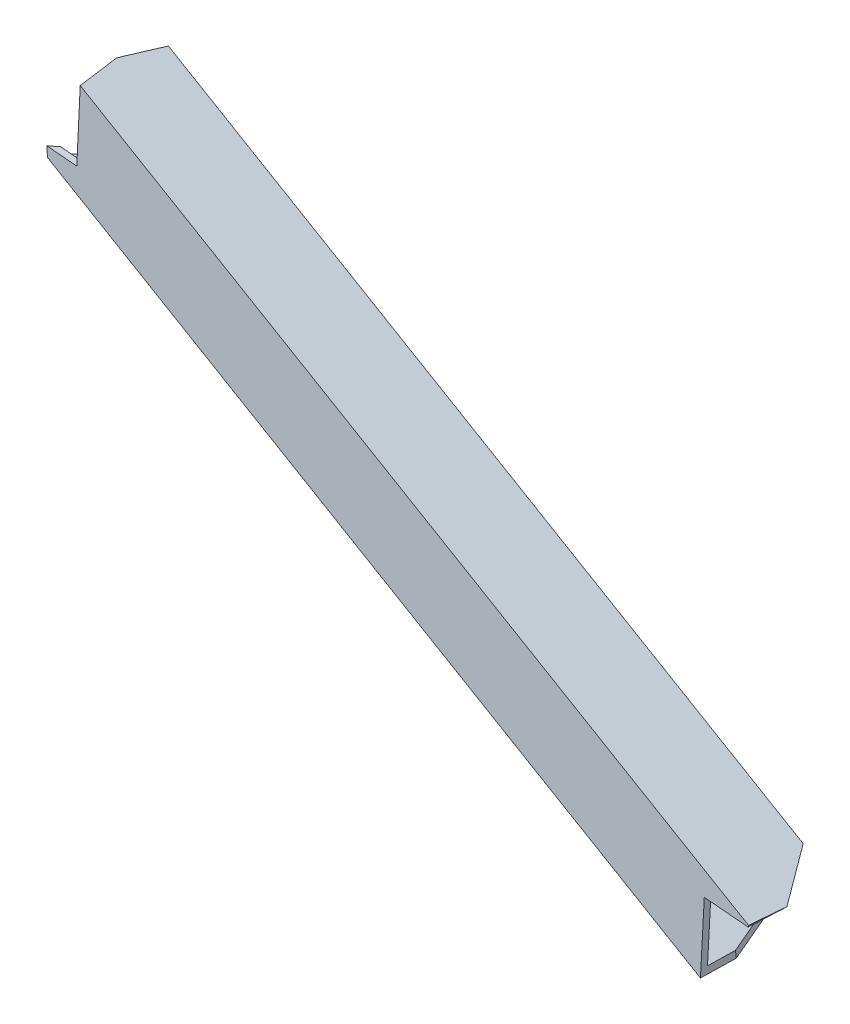
ISO-10303-21;
HEADER;
FILE_DESCRIPTION(('STEP AP214'),'2;1');
FILE_NAME('part.step','',(''),(''),'','','');
FILE_SCHEMA(('AUTOMOTIVE_DESIGN { 1 0 10303 214 1 1 1 1 }'));
ENDSEC;
DATA;
#1=APPLICATION_CONTEXT('core data for automotive mechanical design processes');
#2=APPLICATION_PROTOCOL_DEFINITION('international standard','automotive_design',2000,#1);
#3=PRODUCT_CONTEXT('',#1,'mechanical');
#4=PRODUCT('Part','Part','',(#3));
#5=PRODUCT_RELATED_PRODUCT_CATEGORY('part','',(#4));
#6=PRODUCT_DEFINITION_FORMATION('','',#4);
#7=PRODUCT_DEFINITION_CONTEXT('part definition',#1,'design');
#8=PRODUCT_DEFINITION('design','',#6,#7);
#9=PRODUCT_DEFINITION_SHAPE('','',#8);
#10=(LENGTH_UNIT() NAMED_UNIT(*) SI_UNIT(.MILLI.,.METRE.));
#11=(NAMED_UNIT(*) PLANE_ANGLE_UNIT() SI_UNIT($,.RADIAN.));
#12=(NAMED_UNIT(*) SI_UNIT($,.STERADIAN.) SOLID_ANGLE_UNIT());
#13=UNCERTAINTY_MEASURE_WITH_UNIT(LENGTH_MEASURE(1.E-05),#10,'distance_accuracy_value','');
#14=(GEOMETRIC_REPRESENTATION_CONTEXT(3) GLOBAL_UNCERTAINTY_ASSIGNED_CONTEXT((#13)) GLOBAL_UNIT_ASSIGNED_CONTEXT((#10,
#11,#12)) REPRESENTATION_CONTEXT('',''));
#15=CARTESIAN_POINT('',(0.,0.,0.));
#16=DIRECTION('',(0.,0.,1.));
#17=DIRECTION('',(1.,0.,0.));
#18=AXIS2_PLACEMENT_3D('',#15,#16,#17);
#19=CARTESIAN_POINT('',(-259.935326726564,-10.,-1698.86453408839));
#20=DIRECTION('',(0.,1.,0.));
#21=DIRECTION('',(0.,0.,1.));
#22=AXIS2_PLACEMENT_3D('',#19,#20,#21);
#23=PLANE('',#22);
#24=DIRECTION('',(0.0519070217012584,0.,0.99865192189176));
#25=VECTOR('',#24,1.);
#26=CARTESIAN_POINT('',(-250.99441719747,-10.,-1679.98173316467));
#27=LINE('',#26,#25);
#28=CARTESIAN_POINT('',(-252.538611746394,-10.,-1709.69087084037));
#29=VERTEX_POINT('',#28);
#30=CARTESIAN_POINT('',(-252.402179540687,-10.,-1707.06601817166));
#31=VERTEX_POINT('',#30);
#32=EDGE_CURVE('E174',#29,#31,#27,.T.);
#33=ORIENTED_EDGE('',*,*,#32,.T.);
#34=CARTESIAN_POINT('',(-251.467391304348,-10.,-1697.32050807569));
#35=DIRECTION('',(0.,1.,0.));
#36=DIRECTION('',(-0.480327336741099,0.,0.87708930536132));
#37=AXIS2_PLACEMENT_3D('',#34,#35,#36);
#38=ELLIPSE('',#37,9.93342614996473,9.49999999999999);
#39=CARTESIAN_POINT('',(-248.27907507284,-10.,-1706.71374857818));
#40=VERTEX_POINT('',#39);
#41=EDGE_CURVE('E11',#31,#40,#38,.F.);
#42=ORIENTED_EDGE('',*,*,#41,.T.);
#43=DIRECTION('',(0.0519070217012584,0.,0.99865192189176));
#44=VECTOR('',#43,1.);
#45=CARTESIAN_POINT('',(-246.818497299535,-10.,-1678.61333455754));
#46=LINE('',#45,#44);
#47=CARTESIAN_POINT('',(-248.33243386697,-10.,-1707.74033150591));
#48=VERTEX_POINT('',#47);
#49=EDGE_CURVE('E214',#48,#40,#46,.T.);
#50=ORIENTED_EDGE('',*,*,#49,.F.);
#51=DIRECTION('',(-0.996697420861703,0.,-0.0812049952135342));
#52=VECTOR('',#51,1.);
#53=CARTESIAN_POINT('',(-55.7578427552069,-10.,-1692.05049583245));
#54=LINE('',#53,#52);
#55=CARTESIAN_POINT('',(-237.968255997214,-10.,-1706.89591975497));
#56=VERTEX_POINT('',#55);
#57=EDGE_CURVE('E199',#56,#48,#54,.T.);
#58=ORIENTED_EDGE('',*,*,#57,.F.);
#59=DIRECTION('',(-0.242535625036333,0.,0.970142500145332));
#60=VECTOR('',#59,1.);
#61=CARTESIAN_POINT('',(-165.298574998547,-10.,-1997.57464374964));
#62=LINE('',#61,#60);
#63=CARTESIAN_POINT('',(-237.574318690023,-10.,-1708.47166898373));
#64=VERTEX_POINT('',#63);
#65=EDGE_CURVE('E206',#64,#56,#62,.T.);
#66=ORIENTED_EDGE('',*,*,#65,.F.);
#67=DIRECTION('',(-0.996697420861703,0.,-0.0812049952135336));
#68=VECTOR('',#67,1.);
#69=CARTESIAN_POINT('',(-55.010784211944,-10.,-1693.59747483699));
#70=LINE('',#69,#68);
#71=EDGE_CURVE('E316',#64,#29,#70,.T.);
#72=ORIENTED_EDGE('',*,*,#71,.T.);
#73=EDGE_LOOP('',(#33,#42,#50,#58,#66,#72));
#74=FACE_BOUND('',#73,.T.);
#75=ADVANCED_FACE('F39',(#74),#23,.T.);
#76=CARTESIAN_POINT('',(-63.0871154005148,-89.7690510930017,-1689.74860806712));
#77=DIRECTION('',(0.389788086231143,0.920681692103509,-0.0202600507818227));
#78=DIRECTION('',(-0.920870706243423,0.389868108958324,0.));
#79=AXIS2_PLACEMENT_3D('',#76,#77,#78);
#80=PLANE('',#79);
#81=CARTESIAN_POINT('',(-251.492301515799,-10.1697584780347,-1697.27502142859));
#82=DIRECTION('',(0.389788086231143,0.920681692103509,-0.0202600507818227));
#83=DIRECTION('',(0.66523424743655,-0.266289990776878,0.697533538153956));
#84=AXIS2_PLACEMENT_3D('',#81,#82,#83);
#85=ELLIPSE('',#84,10.1020544804535,9.49999999999999);
#86=CARTESIAN_POINT('',(-246.200919955857,-12.2267833251741,-1688.95064077322));
#87=VERTEX_POINT('',#86);
#88=EDGE_CURVE('E327',#31,#87,#85,.F.);
#89=ORIENTED_EDGE('',*,*,#88,.F.);
#90=ORIENTED_EDGE('',*,*,#32,.F.);
#91=DIRECTION('',(-0.917328644212009,0.386243639668214,-0.0965609099170536));
#92=VECTOR('',#91,1.);
#93=CARTESIAN_POINT('',(-63.0871154005148,-89.7690510930017,-1689.74860806712));
#94=LINE('',#93,#92);
#95=CARTESIAN_POINT('',(-74.1970478620124,-85.0911847934237,-1690.91807464201));
#96=VERTEX_POINT('',#95);
#97=EDGE_CURVE('E225',#96,#29,#94,.T.);
#98=ORIENTED_EDGE('',*,*,#97,.F.);
#99=DIRECTION('',(-0.331543273132427,0.119772265723642,-0.935806423574909));
#100=VECTOR('',#99,1.);
#101=CARTESIAN_POINT('',(-72.4272379255188,-85.7305406880294,-1685.92264978712));
#102=LINE('',#101,#100);
#103=CARTESIAN_POINT('',(-70.0000000000002,-86.6073969217361,-1679.07158379871));
#104=VERTEX_POINT('',#103);
#105=EDGE_CURVE('E285',#104,#96,#102,.T.);
#106=ORIENTED_EDGE('',*,*,#105,.F.);
#107=DIRECTION('',(0.,-0.0220001628763165,-0.999757967126752));
#108=VECTOR('',#107,1.);
#109=CARTESIAN_POINT('',(-70.0000000000002,-86.8437666053328,-1689.81298038252));
#110=LINE('',#109,#108);
#111=CARTESIAN_POINT('',(-70.0000000000002,-86.416644359219,-1670.40317551471));
#112=VERTEX_POINT('',#111);
#113=EDGE_CURVE('E262',#112,#104,#110,.T.);
#114=ORIENTED_EDGE('',*,*,#113,.F.);
#115=DIRECTION('',(-0.917328644212009,0.386243639668214,-0.0965609099170536));
#116=VECTOR('',#115,1.);
#117=CARTESIAN_POINT('',(-64.7086463241079,-88.6445827490684,-1669.84619091725));
#118=LINE('',#117,#116);
#119=EDGE_CURVE('E234',#112,#87,#118,.T.);
#120=ORIENTED_EDGE('',*,*,#119,.T.);
#121=EDGE_LOOP('',(#89,#90,#98,#106,#114,#120));
#122=FACE_BOUND('',#121,.T.);
#123=ADVANCED_FACE('F325',(#122),#80,.F.);
#124=CARTESIAN_POINT('',(-56.9128845994852,-70.2309489069982,-1670.25139193288));
#125=DIRECTION('',(0.0810765461796534,-0.056223417196662,-0.995120857493354));
#126=DIRECTION('',(-0.996697420861703,0.,-0.0812049952135336));
#127=AXIS2_PLACEMENT_3D('',#124,#125,#126);
#128=PLANE('',#127);
#129=CARTESIAN_POINT('',(-256.600489873603,-44.9811161756627,-1687.94734624608));
#130=DIRECTION('',(0.0810765461796534,-0.056223417196662,-0.995120857493354));
#131=DIRECTION('',(-0.125978718068656,-0.99097858296094,0.0457253836124391));
#132=AXIS2_PLACEMENT_3D('',#129,#130,#131);
#133=ELLIPSE('',#132,44.681659567392,9.49999999999999);
#134=CARTESIAN_POINT('',(-246.500195257675,-10.,-1689.10083516881));
#135=VERTEX_POINT('',#134);
#136=EDGE_CURVE('E62',#87,#135,#133,.F.);
#137=ORIENTED_EDGE('',*,*,#136,.F.);
#138=ORIENTED_EDGE('',*,*,#119,.F.);
#139=DIRECTION('',(0.,-0.998407737776047,0.0564091229227733));
#140=VECTOR('',#139,1.);
#141=CARTESIAN_POINT('',(-70.0000000000002,-70.2909999601044,-1671.31425965669));
#142=LINE('',#141,#140);
#143=CARTESIAN_POINT('',(-70.0000000000002,-69.9999999999998,-1671.33070088796));
#144=VERTEX_POINT('',#143);
#145=EDGE_CURVE('E261',#144,#112,#142,.T.);
#146=ORIENTED_EDGE('',*,*,#145,.F.);
#147=DIRECTION('',(-0.996697420861703,0.,-0.0812049952135336));
#148=VECTOR('',#147,1.);
#149=CARTESIAN_POINT('',(-56.9118285034804,-69.9999999999998,-1670.26435429021));
#150=LINE('',#149,#148);
#151=CARTESIAN_POINT('',(-58.4694290318394,-69.9999999999998,-1670.39125834434));
#152=VERTEX_POINT('',#151);
#153=EDGE_CURVE('E266',#152,#144,#150,.T.);
#154=ORIENTED_EDGE('',*,*,#153,.F.);
#155=DIRECTION('',(-0.199222248814033,-0.97917434035687,0.0390910061800458));
#156=VECTOR('',#155,1.);
#157=CARTESIAN_POINT('',(-58.4537917747577,-69.9231431179037,-1670.39432665682));
#158=LINE('',#157,#156);
#159=CARTESIAN_POINT('',(-58.389887195482,-69.6090530771048,-1670.40686589036));
#160=VERTEX_POINT('',#159);
#161=EDGE_CURVE('E291',#160,#152,#158,.T.);
#162=ORIENTED_EDGE('',*,*,#161,.F.);
#163=DIRECTION('',(-0.917328644212009,0.386243639668214,-0.0965609099170536));
#164=VECTOR('',#163,1.);
#165=CARTESIAN_POINT('',(-56.9128845994852,-70.2309489069982,-1670.25139193288));
#166=LINE('',#165,#164);
#167=CARTESIAN_POINT('',(-238.722245095367,6.32036077547827,-1689.3892193535));
#168=VERTEX_POINT('',#167);
#169=EDGE_CURVE('E232',#160,#168,#166,.T.);
#170=ORIENTED_EDGE('',*,*,#169,.T.);
#171=DIRECTION('',(-0.00650701564536868,0.998356602920274,-0.056936386896976));
#172=VECTOR('',#171,1.);
#173=CARTESIAN_POINT('',(-238.210154803049,-72.2484874476755,-1684.90842929572));
#174=LINE('',#173,#172);
#175=CARTESIAN_POINT('',(-238.615873441598,-10.,-1688.45846738302));
#176=VERTEX_POINT('',#175);
#177=EDGE_CURVE('E209',#176,#168,#174,.T.);
#178=ORIENTED_EDGE('',*,*,#177,.F.);
#179=DIRECTION('',(0.996697420861703,0.,0.0812049952135336));
#180=VECTOR('',#179,1.);
#181=CARTESIAN_POINT('',(-56.6374571669114,-10.,-1673.63194519761));
#182=LINE('',#181,#180);
#183=EDGE_CURVE('E202',#135,#176,#182,.T.);
#184=ORIENTED_EDGE('',*,*,#183,.F.);
#185=EDGE_LOOP('',(#137,#138,#146,#154,#162,#170,#178,#184));
#186=FACE_BOUND('',#185,.T.);
#187=ADVANCED_FACE('F357',(#186),#128,.F.);
#188=CARTESIAN_POINT('',(-55.2913536758921,-71.3554172509315,-1690.15380908275));
#189=DIRECTION('',(-0.389788086231143,-0.920681692103509,0.0202600507818227));
#190=DIRECTION('',(0.920870706243423,-0.389868108958324,0.));
#191=AXIS2_PLACEMENT_3D('',#188,#189,#190);
#192=PLANE('',#191);
#193=CARTESIAN_POINT('',(-248.507698484202,10.1697584780347,-1702.72497857141));
#194=DIRECTION('',(-0.389788086231143,-0.920681692103509,0.0202600507818227));
#195=DIRECTION('',(0.66523424743655,-0.266289990776878,0.697533538153956));
#196=AXIS2_PLACEMENT_3D('',#193,#194,#195);
#197=ELLIPSE('',#196,10.1020544804535,9.49999999999999);
#198=CARTESIAN_POINT('',(-239.849469145952,6.58054772504688,-1699.25242979613));
#199=VERTEX_POINT('',#198);
#200=CARTESIAN_POINT('',(-239.601381429903,6.45106723792768,-1700.36341802421));
#201=VERTEX_POINT('',#200);
#202=EDGE_CURVE('E236',#199,#201,#197,.F.);
#203=ORIENTED_EDGE('',*,*,#202,.F.);
#204=DIRECTION('',(-0.113507613195636,0.0261999374612772,-0.993191615461818));
#205=VECTOR('',#204,1.);
#206=CARTESIAN_POINT('',(-236.214121953579,5.74143335721979,-1667.44314186286));
#207=LINE('',#206,#205);
#208=EDGE_CURVE('E205',#168,#199,#207,.T.);
#209=ORIENTED_EDGE('',*,*,#208,.F.);
#210=ORIENTED_EDGE('',*,*,#169,.F.);
#211=DIRECTION('',(-0.0422484460755079,0.039855023737651,0.998311898099525));
#212=VECTOR('',#211,1.);
#213=CARTESIAN_POINT('',(-57.5485466570465,-70.4027307207954,-1690.28736678198));
#214=LINE('',#213,#212);
#215=CARTESIAN_POINT('',(-58.0135824280842,-69.9640397530746,-1679.29877935703));
#216=VERTEX_POINT('',#215);
#217=EDGE_CURVE('E290',#216,#160,#214,.T.);
#218=ORIENTED_EDGE('',*,*,#217,.F.);
#219=DIRECTION('',(0.5451826238665,-0.212971064645943,0.810813931958259));
#220=VECTOR('',#219,1.);
#221=CARTESIAN_POINT('',(-61.8412956585872,-68.4687753661099,-1684.99148319418));
#222=LINE('',#221,#220);
#223=CARTESIAN_POINT('',(-66.0756795254059,-66.8146484721888,-1691.28900127744));
#224=VERTEX_POINT('',#223);
#225=EDGE_CURVE('E270',#224,#216,#222,.T.);
#226=ORIENTED_EDGE('',*,*,#225,.F.);
#227=DIRECTION('',(-0.917328644212009,0.386243639668214,-0.0965609099170536));
#228=VECTOR('',#227,1.);
#229=CARTESIAN_POINT('',(-55.2913536758921,-71.3554172509315,-1690.15380908275));
#230=LINE('',#229,#228);
#231=CARTESIAN_POINT('',(-237.362439306566,5.30609248829959,-1709.31918651756));
#232=VERTEX_POINT('',#231);
#233=EDGE_CURVE('E229',#224,#232,#230,.T.);
#234=ORIENTED_EDGE('',*,*,#233,.T.);
#235=DIRECTION('',(0.240691344665425,-0.123087376499567,-0.962765378661698));
#236=VECTOR('',#235,1.);
#237=CARTESIAN_POINT('',(-228.98463870736,1.02176104287016,-1742.83038891438));
#238=LINE('',#237,#236);
#239=EDGE_CURVE('E272',#201,#232,#238,.T.);
#240=ORIENTED_EDGE('',*,*,#239,.F.);
#241=EDGE_LOOP('',(#203,#209,#210,#218,#226,#234,#240));
#242=FACE_BOUND('',#241,.T.);
#243=ADVANCED_FACE('F370',(#242),#192,.F.);
#244=CARTESIAN_POINT('',(-55.2913536758921,-71.3554172509315,-1690.15380908275));
#245=DIRECTION('',(-0.0810765461796534,0.056223417196662,0.995120857493354));
#246=DIRECTION('',(0.996697420861703,0.,0.0812049952135336));
#247=AXIS2_PLACEMENT_3D('',#244,#245,#246);
#248=PLANE('',#247);
#249=ORIENTED_EDGE('',*,*,#71,.F.);
#250=DIRECTION('',(-0.0138203212509284,-0.998375169086681,0.0552812850037135));
#251=VECTOR('',#250,1.);
#252=CARTESIAN_POINT('',(-238.400071148149,-69.6520685038425,-1705.16865915123));
#253=LINE('',#252,#251);
#254=EDGE_CURVE('E210',#232,#64,#253,.T.);
#255=ORIENTED_EDGE('',*,*,#254,.F.);
#256=ORIENTED_EDGE('',*,*,#233,.F.);
#257=DIRECTION('',(0.994614005315425,-0.0601185166345809,0.0844318920080898));
#258=VECTOR('',#257,1.);
#259=CARTESIAN_POINT('',(-55.0403652895334,-67.4816677569683,-1690.35222333659));
#260=LINE('',#259,#258);
#261=CARTESIAN_POINT('',(-75.3880820949328,-66.2517689774382,-1692.07952279019));
#262=VERTEX_POINT('',#261);
#263=EDGE_CURVE('E256',#262,#224,#260,.T.);
#264=ORIENTED_EDGE('',*,*,#263,.F.);
#265=DIRECTION('',(-0.0629752890348987,0.996123892552847,-0.061410940852061));
#266=VECTOR('',#265,1.);
#267=CARTESIAN_POINT('',(-74.9807753597959,-72.6944225433909,-1691.68233382602));
#268=LINE('',#267,#266);
#269=EDGE_CURVE('E267',#96,#262,#268,.T.);
#270=ORIENTED_EDGE('',*,*,#269,.F.);
#271=ORIENTED_EDGE('',*,*,#97,.T.);
#272=EDGE_LOOP('',(#249,#255,#256,#264,#270,#271));
#273=FACE_BOUND('',#272,.T.);
#274=ADVANCED_FACE('F329',(#273),#248,.F.);
#275=CARTESIAN_POINT('',(-56.0447370877494,-72.7385504907824,-1688.52919962951));
#276=DIRECTION('',(-0.081076546179654,0.0562234171966604,0.995120857493354));
#277=DIRECTION('',(0.996697420861703,0.,0.0812049952135342));
#278=AXIS2_PLACEMENT_3D('',#275,#276,#277);
#279=PLANE('',#278);
#280=DIRECTION('',(-0.013820321250928,-0.998375169086681,0.055281285003712));
#281=VECTOR('',#280,1.);
#282=CARTESIAN_POINT('',(-238.81319872597,-71.0383669362445,-1703.51614883994));
#283=LINE('',#282,#281);
#284=CARTESIAN_POINT('',(-237.777495030095,3.78050548494219,-1707.65896362344));
#285=VERTEX_POINT('',#284);
#286=EDGE_CURVE('E228',#285,#56,#283,.T.);
#287=ORIENTED_EDGE('',*,*,#286,.T.);
#288=ORIENTED_EDGE('',*,*,#57,.T.);
#289=DIRECTION('',(-0.917328644212009,0.386243639668214,-0.0965609099170536));
#290=VECTOR('',#289,1.);
#291=CARTESIAN_POINT('',(-62.5931769364322,-88.2060029181212,-1688.18883077638));
#292=LINE('',#291,#290);
#293=CARTESIAN_POINT('',(-73.7188102055264,-83.5215257521868,-1689.35995006786));
#294=VERTEX_POINT('',#293);
#295=EDGE_CURVE('E211',#294,#48,#292,.T.);
#296=ORIENTED_EDGE('',*,*,#295,.F.);
#297=DIRECTION('',(-0.0629752890348982,0.996123892552847,-0.0614109408520595));
#298=VECTOR('',#297,1.);
#299=CARTESIAN_POINT('',(-74.3219328778287,-73.9815154842255,-1689.94809077071));
#300=LINE('',#299,#298);
#301=CARTESIAN_POINT('',(-74.7840448905734,-66.6719687717751,-1690.39872361284));
#302=VERTEX_POINT('',#301);
#303=EDGE_CURVE('E278',#294,#302,#300,.T.);
#304=ORIENTED_EDGE('',*,*,#303,.T.);
#305=DIRECTION('',(0.994614005315425,-0.060118516634581,0.0844318920080903));
#306=VECTOR('',#305,1.);
#307=CARTESIAN_POINT('',(-55.7263062763036,-67.8238960217197,-1688.78092925242));
#308=LINE('',#307,#306);
#309=CARTESIAN_POINT('',(-69.7268905968333,-66.9776437501155,-1689.96942631468));
#310=VERTEX_POINT('',#309);
#311=EDGE_CURVE('E224',#302,#310,#308,.T.);
#312=ORIENTED_EDGE('',*,*,#311,.T.);
#313=DIRECTION('',(-0.917328644212009,0.386243639668214,-0.0965609099170536));
#314=VECTOR('',#313,1.);
#315=CARTESIAN_POINT('',(-56.0447370877494,-72.7385504907824,-1688.52919962951));
#316=LINE('',#315,#314);
#317=EDGE_CURVE('E221',#310,#285,#316,.T.);
#318=ORIENTED_EDGE('',*,*,#317,.T.);
#319=EDGE_LOOP('',(#287,#288,#296,#304,#312,#318));
#320=FACE_BOUND('',#319,.T.);
#321=ADVANCED_FACE('F41',(#320),#279,.T.);
#322=CARTESIAN_POINT('',(-56.0447370877494,-72.7385504907824,-1688.52919962951));
#323=DIRECTION('',(-0.389788086231143,-0.920681692103509,0.0202600507818227));
#324=DIRECTION('',(0.920870706243423,-0.389868108958324,0.));
#325=AXIS2_PLACEMENT_3D('',#322,#323,#324);
#326=PLANE('',#325);
#327=DIRECTION('',(-0.917328644212009,0.386243639668214,-0.0965609099170536));
#328=VECTOR('',#327,1.);
#329=CARTESIAN_POINT('',(-57.4068230635673,-71.7939970818785,-1671.81116922362));
#330=LINE('',#329,#328);
#331=CARTESIAN_POINT('',(-61.6675661330291,-69.9999999999998,-1672.25966849409));
#332=VERTEX_POINT('',#331);
#333=CARTESIAN_POINT('',(-238.896661482556,4.62277698927478,-1690.91536274141));
#334=VERTEX_POINT('',#333);
#335=EDGE_CURVE('E217',#332,#334,#330,.T.);
#336=ORIENTED_EDGE('',*,*,#335,.T.);
#337=DIRECTION('',(-0.113507613195636,0.0261999374612772,-0.993191615461818));
#338=VECTOR('',#337,1.);
#339=CARTESIAN_POINT('',(-236.041733359391,3.9637997085662,-1665.93474166371));
#340=LINE('',#339,#338);
#341=CARTESIAN_POINT('',(-239.858774037238,4.84485274308265,-1699.33384759487));
#342=VERTEX_POINT('',#341);
#343=EDGE_CURVE('E220',#334,#342,#340,.T.);
#344=ORIENTED_EDGE('',*,*,#343,.T.);
#345=DIRECTION('',(0.240691344665425,-0.123087376499567,-0.962765378661698));
#346=VECTOR('',#345,1.);
#347=CARTESIAN_POINT('',(-229.41526220707,-0.495864740566232,-1741.10789491555));
#348=LINE('',#347,#346);
#349=EDGE_CURVE('E247',#342,#285,#348,.T.);
#350=ORIENTED_EDGE('',*,*,#349,.T.);
#351=ORIENTED_EDGE('',*,*,#317,.F.);
#352=DIRECTION('',(0.5451826238665,-0.212971064645943,0.810813931958259));
#353=VECTOR('',#352,1.);
#354=CARTESIAN_POINT('',(-64.3546966469618,-69.0762467042492,-1681.97971881291));
#355=LINE('',#354,#353);
#356=CARTESIAN_POINT('',(-61.9899892796963,-69.9999999999998,-1678.46284649445));
#357=VERTEX_POINT('',#356);
#358=EDGE_CURVE('E195',#310,#357,#355,.T.);
#359=ORIENTED_EDGE('',*,*,#358,.T.);
#360=DIRECTION('',(0.0519070217012584,0.,0.99865192189176));
#361=VECTOR('',#360,1.);
#362=CARTESIAN_POINT('',(-62.4957807758298,-69.9999999999998,-1688.19389314547));
#363=LINE('',#362,#361);
#364=EDGE_CURVE('E190',#357,#332,#363,.T.);
#365=ORIENTED_EDGE('',*,*,#364,.T.);
#366=EDGE_LOOP('',(#336,#344,#350,#351,#359,#365));
#367=FACE_BOUND('',#366,.T.);
#368=ADVANCED_FACE('F344',(#367),#326,.T.);
#369=CARTESIAN_POINT('',(-57.4068230635673,-71.7939970818785,-1671.81116922362));
#370=DIRECTION('',(0.0810765461796534,-0.056223417196662,-0.995120857493354));
#371=DIRECTION('',(-0.996697420861703,0.,-0.0812049952135336));
#372=AXIS2_PLACEMENT_3D('',#369,#370,#371);
#373=PLANE('',#372);
#374=DIRECTION('',(-0.917328644212009,0.386243639668214,-0.0965609099170536));
#375=VECTOR('',#374,1.);
#376=CARTESIAN_POINT('',(-63.9552629122506,-87.2614495092173,-1671.47080037049));
#377=LINE('',#376,#375);
#378=CARTESIAN_POINT('',(-70.0000000000002,-84.7162970512174,-1672.10708848499));
#379=VERTEX_POINT('',#378);
#380=CARTESIAN_POINT('',(-244.687864207849,-11.1635121215968,-1690.49528471739));
#381=VERTEX_POINT('',#380);
#382=EDGE_CURVE('E183',#379,#381,#377,.T.);
#383=ORIENTED_EDGE('',*,*,#382,.T.);
#384=CARTESIAN_POINT('',(-255.544411493826,-37.7841375875564,-1689.87577084671));
#385=DIRECTION('',(0.0810765461796534,-0.056223417196662,-0.995120857493354));
#386=DIRECTION('',(-0.125978718068656,-0.99097858296094,0.0457253836124391));
#387=AXIS2_PLACEMENT_3D('',#384,#385,#386);
#388=ELLIPSE('',#387,44.681659567392,9.49999999999999);
#389=CARTESIAN_POINT('',(-244.741471585079,-10.,-1690.56538969801));
#390=VERTEX_POINT('',#389);
#391=EDGE_CURVE('E169',#381,#390,#388,.F.);
#392=ORIENTED_EDGE('',*,*,#391,.T.);
#393=DIRECTION('',(0.996697420861703,0.,0.0812049952135336));
#394=VECTOR('',#393,1.);
#395=CARTESIAN_POINT('',(-57.1242480373791,-10.,-1675.27945093537));
#396=LINE('',#395,#394);
#397=CARTESIAN_POINT('',(-238.801354216225,-10.,-1690.08142416101));
#398=VERTEX_POINT('',#397);
#399=EDGE_CURVE('E179',#390,#398,#396,.T.);
#400=ORIENTED_EDGE('',*,*,#399,.T.);
#401=DIRECTION('',(-0.00650701564536868,0.998356602920274,-0.056936386896976));
#402=VECTOR('',#401,1.);
#403=CARTESIAN_POINT('',(-238.385471166749,-73.8079898859503,-1686.4424474781));
#404=LINE('',#403,#402);
#405=EDGE_CURVE('E189',#398,#334,#404,.T.);
#406=ORIENTED_EDGE('',*,*,#405,.T.);
#407=ORIENTED_EDGE('',*,*,#335,.F.);
#408=DIRECTION('',(-0.996697420861703,0.,-0.0812049952135336));
#409=VECTOR('',#408,1.);
#410=CARTESIAN_POINT('',(-57.3986193739481,-69.9999999999998,-1671.91186002797));
#411=LINE('',#410,#409);
#412=CARTESIAN_POINT('',(-70.0000000000002,-69.9999999999998,-1672.93854579238));
#413=VERTEX_POINT('',#412);
#414=EDGE_CURVE('E192',#332,#413,#411,.T.);
#415=ORIENTED_EDGE('',*,*,#414,.T.);
#416=DIRECTION('',(0.,-0.998407737776047,0.0564091229227733));
#417=VECTOR('',#416,1.);
#418=CARTESIAN_POINT('',(-70.0000000000002,-71.8517816672392,-1672.83392182389));
#419=LINE('',#418,#417);
#420=EDGE_CURVE('E216',#413,#379,#419,.T.);
#421=ORIENTED_EDGE('',*,*,#420,.T.);
#422=EDGE_LOOP('',(#383,#392,#400,#406,#407,#415,#421));
#423=FACE_BOUND('',#422,.T.);
#424=ADVANCED_FACE('F177',(#423),#373,.T.);
#425=CARTESIAN_POINT('',(-62.5931769364322,-88.2060029181212,-1688.18883077638));
#426=DIRECTION('',(0.389788086231143,0.920681692103509,-0.0202600507818227));
#427=DIRECTION('',(-0.920870706243423,0.389868108958324,0.));
#428=AXIS2_PLACEMENT_3D('',#425,#426,#427);
#429=PLANE('',#428);
#430=ORIENTED_EDGE('',*,*,#49,.T.);
#431=CARTESIAN_POINT('',(-251.253533273271,-8.5425971215487,-1697.71101800002));
#432=DIRECTION('',(0.389788086231143,0.920681692103509,-0.0202600507818227));
#433=DIRECTION('',(0.66523424743655,-0.266289990776878,0.697533538153956));
#434=AXIS2_PLACEMENT_3D('',#431,#432,#433);
#435=ELLIPSE('',#434,10.1020544804535,9.49999999999999);
#436=EDGE_CURVE('E361',#40,#381,#435,.F.);
#437=ORIENTED_EDGE('',*,*,#436,.T.);
#438=ORIENTED_EDGE('',*,*,#382,.F.);
#439=DIRECTION('',(0.,-0.0220001628763165,-0.999757967126752));
#440=VECTOR('',#439,1.);
#441=CARTESIAN_POINT('',(-70.0000000000002,-85.0717014121513,-1688.25780261346));
#442=LINE('',#441,#440);
#443=CARTESIAN_POINT('',(-70.0000000000002,-84.8649712695814,-1678.86332184341));
#444=VERTEX_POINT('',#443);
#445=EDGE_CURVE('E252',#379,#444,#442,.T.);
#446=ORIENTED_EDGE('',*,*,#445,.T.);
#447=DIRECTION('',(-0.331543273132427,0.119772265723642,-0.935806423574909));
#448=VECTOR('',#447,1.);
#449=CARTESIAN_POINT('',(-71.9464991336396,-84.1617851989897,-1684.35746556569));
#450=LINE('',#449,#448);
#451=EDGE_CURVE('E295',#444,#294,#450,.T.);
#452=ORIENTED_EDGE('',*,*,#451,.T.);
#453=ORIENTED_EDGE('',*,*,#295,.T.);
#454=EDGE_LOOP('',(#430,#437,#438,#446,#452,#453));
#455=FACE_BOUND('',#454,.T.);
#456=ADVANCED_FACE('F351',(#455),#429,.T.);
#457=CARTESIAN_POINT('',(-60.,-80.,-1680.));
#458=DIRECTION('',(0.979114049590753,-0.197241393803742,0.0493103484509357));
#459=DIRECTION('',(0.197481629250392,0.980306587812512,0.));
#460=AXIS2_PLACEMENT_3D('',#457,#458,#459);
#461=PLANE('',#460);
#462=ORIENTED_EDGE('',*,*,#161,.T.);
#463=DIRECTION('',(0.0502984641771046,0.,-0.998734231165341));
#464=VECTOR('',#463,1.);
#465=CARTESIAN_POINT('',(-57.9906080820512,-69.9999999999998,-1679.89880258006));
#466=LINE('',#465,#464);
#467=CARTESIAN_POINT('',(-58.0286483947006,-69.9999999999998,-1679.14346813737));
#468=VERTEX_POINT('',#467);
#469=EDGE_CURVE('E294',#152,#468,#466,.T.);
#470=ORIENTED_EDGE('',*,*,#469,.T.);
#471=DIRECTION('',(0.0940856984357503,0.224568727252764,-0.969905545963075));
#472=VECTOR('',#471,1.);
#473=CARTESIAN_POINT('',(-58.179223923749,-70.3594016463287,-1677.59122328891));
#474=LINE('',#473,#472);
#475=EDGE_CURVE('E297',#468,#216,#474,.T.);
#476=ORIENTED_EDGE('',*,*,#475,.T.);
#477=ORIENTED_EDGE('',*,*,#217,.T.);
#478=EDGE_LOOP('',(#462,#470,#476,#477));
#479=FACE_BOUND('',#478,.T.);
#480=ADVANCED_FACE('F374',(#479),#461,.T.);
#481=CARTESIAN_POINT('',(-70.0000000000002,-89.9999999999998,-1085.));
#482=DIRECTION('',(1.,0.,0.));
#483=DIRECTION('',(0.,0.,-1.));
#484=AXIS2_PLACEMENT_3D('',#481,#482,#483);
#485=PLANE('',#484);
#486=ORIENTED_EDGE('',*,*,#113,.T.);
#487=DIRECTION('',(0.,0.992932622114171,0.118679433523578));
#488=VECTOR('',#487,1.);
#489=CARTESIAN_POINT('',(-70.0000000000002,-19.9464157685872,-1671.10398629492));
#490=LINE('',#489,#488);
#491=EDGE_CURVE('E258',#104,#444,#490,.T.);
#492=ORIENTED_EDGE('',*,*,#491,.T.);
#493=ORIENTED_EDGE('',*,*,#445,.F.);
#494=ORIENTED_EDGE('',*,*,#420,.F.);
#495=DIRECTION('',(0.,0.,-1.));
#496=VECTOR('',#495,1.);
#497=CARTESIAN_POINT('',(-70.0000000000002,-69.9999999999998,-1085.));
#498=LINE('',#497,#496);
#499=EDGE_CURVE('E257',#144,#413,#498,.T.);
#500=ORIENTED_EDGE('',*,*,#499,.F.);
#501=ORIENTED_EDGE('',*,*,#145,.T.);
#502=EDGE_LOOP('',(#486,#492,#493,#494,#500,#501));
#503=FACE_BOUND('',#502,.T.);
#504=ADVANCED_FACE('F353',(#503),#485,.T.);
#505=CARTESIAN_POINT('',(-69.8278499414046,-90.1197565625013,-1678.99805556793));
#506=DIRECTION('',(0.94343640931858,0.0393485848218569,-0.3292103133934));
#507=DIRECTION('',(-0.329465469723453,0.,-0.944167625085665));
#508=AXIS2_PLACEMENT_3D('',#505,#506,#507);
#509=PLANE('',#508);
#510=ORIENTED_EDGE('',*,*,#105,.T.);
#511=ORIENTED_EDGE('',*,*,#269,.T.);
#512=DIRECTION('',(-0.329210313393401,0.229015870186713,-0.916063480746854));
#513=VECTOR('',#512,1.);
#514=CARTESIAN_POINT('',(-69.0408782449674,-70.6672151339358,-1674.4177381642));
#515=LINE('',#514,#513);
#516=EDGE_CURVE('E253',#302,#262,#515,.T.);
#517=ORIENTED_EDGE('',*,*,#516,.F.);
#518=ORIENTED_EDGE('',*,*,#303,.F.);
#519=ORIENTED_EDGE('',*,*,#451,.F.);
#520=ORIENTED_EDGE('',*,*,#491,.F.);
#521=EDGE_LOOP('',(#510,#511,#517,#518,#519,#520));
#522=FACE_BOUND('',#521,.T.);
#523=ADVANCED_FACE('F334',(#522),#509,.T.);
#524=CARTESIAN_POINT('',(-50.0000000000002,-69.9999999999998,-1085.));
#525=DIRECTION('',(0.,-1.,0.));
#526=DIRECTION('',(0.,0.,-1.));
#527=AXIS2_PLACEMENT_3D('',#524,#525,#526);
#528=PLANE('',#527);
#529=DIRECTION('',(0.985558600813723,0.,-0.169334711037329));
#530=VECTOR('',#529,1.);
#531=CARTESIAN_POINT('',(-149.386391562455,-69.9999999999998,-1663.44674850288));
#532=LINE('',#531,#530);
#533=EDGE_CURVE('E263',#357,#468,#532,.T.);
#534=ORIENTED_EDGE('',*,*,#533,.T.);
#535=ORIENTED_EDGE('',*,*,#469,.F.);
#536=ORIENTED_EDGE('',*,*,#153,.T.);
#537=ORIENTED_EDGE('',*,*,#499,.T.);
#538=ORIENTED_EDGE('',*,*,#414,.F.);
#539=ORIENTED_EDGE('',*,*,#364,.F.);
#540=EDGE_LOOP('',(#534,#535,#536,#537,#538,#539));
#541=FACE_BOUND('',#540,.T.);
#542=ADVANCED_FACE('F377',(#541),#528,.T.);
#543=CARTESIAN_POINT('',(-50.1721500585959,-69.8802434374987,-1681.00194443207));
#544=DIRECTION('',(-0.0393485848218571,-0.972627071428274,-0.229015870186713));
#545=DIRECTION('',(0.,0.229193370242402,-0.973380911584426));
#546=AXIS2_PLACEMENT_3D('',#543,#544,#545);
#547=PLANE('',#546);
#548=ORIENTED_EDGE('',*,*,#516,.T.);
#549=ORIENTED_EDGE('',*,*,#263,.T.);
#550=ORIENTED_EDGE('',*,*,#225,.T.);
#551=ORIENTED_EDGE('',*,*,#475,.F.);
#552=ORIENTED_EDGE('',*,*,#533,.F.);
#553=ORIENTED_EDGE('',*,*,#358,.F.);
#554=ORIENTED_EDGE('',*,*,#311,.F.);
#555=EDGE_LOOP('',(#548,#549,#550,#551,#552,#553,#554));
#556=FACE_BOUND('',#555,.T.);
#557=ADVANCED_FACE('F337',(#556),#547,.T.);
#558=CARTESIAN_POINT('',(-165.298574998547,-10.,-1997.57464374964));
#559=DIRECTION('',(-0.970142500145332,0.,-0.242535625036333));
#560=DIRECTION('',(-0.242535625036333,0.,0.970142500145332));
#561=AXIS2_PLACEMENT_3D('',#558,#559,#560);
#562=PLANE('',#561);
#563=DIRECTION('',(0.,-1.,0.));
#564=VECTOR('',#563,1.);
#565=CARTESIAN_POINT('',(-239.858774037238,-10.,-1699.33384759487));
#566=LINE('',#565,#564);
#567=CARTESIAN_POINT('',(-239.858774037238,6.12393332948732,-1699.33384759487));
#568=VERTEX_POINT('',#567);
#569=EDGE_CURVE('E203',#568,#342,#566,.T.);
#570=ORIENTED_EDGE('',*,*,#569,.F.);
#571=CARTESIAN_POINT('',(-231.034262268948,129.247990463464,-1734.63189466803));
#572=DIRECTION('',(-0.970142500145332,0.,-0.242535625036333));
#573=DIRECTION('',(-0.0687394638953399,-0.958995862221252,0.274957855581359));
#574=AXIS2_PLACEMENT_3D('',#571,#572,#573);
#575=ELLIPSE('',#574,128.387536830015,9.49999999999999);
#576=EDGE_CURVE('E54',#568,#201,#575,.F.);
#577=ORIENTED_EDGE('',*,*,#576,.T.);
#578=ORIENTED_EDGE('',*,*,#239,.T.);
#579=ORIENTED_EDGE('',*,*,#254,.T.);
#580=ORIENTED_EDGE('',*,*,#65,.T.);
#581=ORIENTED_EDGE('',*,*,#286,.F.);
#582=ORIENTED_EDGE('',*,*,#349,.F.);
#583=EDGE_LOOP('',(#570,#577,#578,#579,#580,#581,#582));
#584=FACE_BOUND('',#583,.T.);
#585=ADVANCED_FACE('F348',(#584),#562,.T.);
#586=CARTESIAN_POINT('',(-240.064673273436,-10.,-1701.13546591161));
#587=DIRECTION('',(-0.993532672656404,0.,0.113546591160732));
#588=DIRECTION('',(0.113546591160732,0.,0.993532672656404));
#589=AXIS2_PLACEMENT_3D('',#586,#587,#588);
#590=PLANE('',#589);
#591=ORIENTED_EDGE('',*,*,#208,.T.);
#592=CARTESIAN_POINT('',(-241.672714271624,56.7489101489333,-1715.20582464575));
#593=DIRECTION('',(-0.993532672656404,0.,0.113546591160732));
#594=DIRECTION('',(0.0274929033858099,-0.970244108037456,0.240562904625837));
#595=AXIS2_PLACEMENT_3D('',#592,#593,#594);
#596=ELLIPSE('',#595,56.3711108055408,9.49999999999999);
#597=EDGE_CURVE('E243',#199,#568,#596,.F.);
#598=ORIENTED_EDGE('',*,*,#597,.T.);
#599=ORIENTED_EDGE('',*,*,#569,.T.);
#600=ORIENTED_EDGE('',*,*,#343,.F.);
#601=ORIENTED_EDGE('',*,*,#405,.F.);
#602=DIRECTION('',(0.113546591160732,0.,0.993532672656404));
#603=VECTOR('',#602,1.);
#604=CARTESIAN_POINT('',(-240.064673273436,-10.,-1701.13546591161));
#605=LINE('',#604,#603);
#606=EDGE_CURVE('E188',#398,#176,#605,.T.);
#607=ORIENTED_EDGE('',*,*,#606,.T.);
#608=ORIENTED_EDGE('',*,*,#177,.T.);
#609=EDGE_LOOP('',(#591,#598,#599,#600,#601,#607,#608));
#610=FACE_BOUND('',#609,.T.);
#611=ADVANCED_FACE('F365',(#610),#590,.T.);
#612=ORIENTED_EDGE('',*,*,#399,.F.);
#613=EDGE_CURVE('E43',#390,#135,#38,.F.);
#614=ORIENTED_EDGE('',*,*,#613,.T.);
#615=ORIENTED_EDGE('',*,*,#183,.T.);
#616=ORIENTED_EDGE('',*,*,#606,.F.);
#617=EDGE_LOOP('',(#612,#614,#615,#616));
#618=FACE_BOUND('',#617,.T.);
#619=ADVANCED_FACE('F186',(#618),#23,.T.);
#620=CARTESIAN_POINT('',(-115.,920.,-1946.51325703663));
#621=DIRECTION('',(-0.140336447675245,-0.956366902675742,0.256257739239816));
#622=DIRECTION('',(0.,-0.258819045102517,-0.965925826289069));
#623=AXIS2_PLACEMENT_3D('',#620,#621,#622);
#624=CYLINDRICAL_SURFACE('',#623,9.49999999999999);
#625=ORIENTED_EDGE('',*,*,#41,.F.);
#626=ORIENTED_EDGE('',*,*,#88,.T.);
#627=ORIENTED_EDGE('',*,*,#136,.T.);
#628=ORIENTED_EDGE('',*,*,#613,.F.);
#629=ORIENTED_EDGE('',*,*,#391,.F.);
#630=ORIENTED_EDGE('',*,*,#436,.F.);
#631=EDGE_LOOP('',(#625,#626,#627,#628,#629,#630));
#632=FACE_BOUND('',#631,.T.);
#633=ADVANCED_FACE('F168',(#632),#624,.F.);
#634=ORIENTED_EDGE('',*,*,#202,.T.);
#635=ORIENTED_EDGE('',*,*,#576,.F.);
#636=ORIENTED_EDGE('',*,*,#597,.F.);
#637=EDGE_LOOP('',(#634,#635,#636));
#638=FACE_BOUND('',#637,.T.);
#639=ADVANCED_FACE('F367',(#638),#624,.F.);
#640=CLOSED_SHELL('',(#75,#123,#187,#243,#274,#321,#368,#424,#456,#480,#504,#523,#542,#557,#585,
#611,#619,#633,#639));
#641=MANIFOLD_SOLID_BREP('B2',#640);
#642=ADVANCED_BREP_SHAPE_REPRESENTATION('',(#18,#641),#14);
#643=SHAPE_DEFINITION_REPRESENTATION(#9,#642);
ENDSEC;
END-ISO-10303-21;
